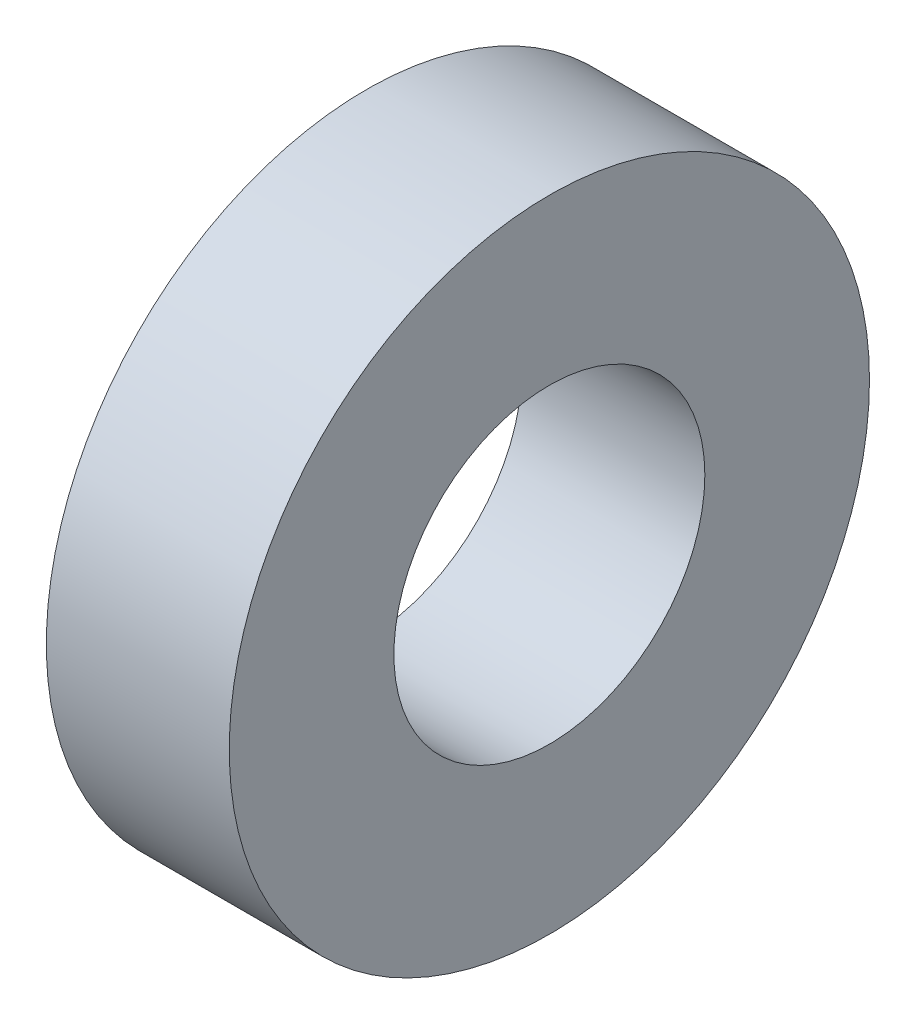
ISO-10303-21;
HEADER;
FILE_DESCRIPTION(('STEP AP214'),'2;1');
FILE_NAME('part.step','',(''),(''),'','','');
FILE_SCHEMA(('AUTOMOTIVE_DESIGN { 1 0 10303 214 1 1 1 1 }'));
ENDSEC;
DATA;
#1=APPLICATION_CONTEXT('core data for automotive mechanical design processes');
#2=APPLICATION_PROTOCOL_DEFINITION('international standard','automotive_design',2000,#1);
#3=PRODUCT_CONTEXT('',#1,'mechanical');
#4=PRODUCT('Part','Part','',(#3));
#5=PRODUCT_RELATED_PRODUCT_CATEGORY('part','',(#4));
#6=PRODUCT_DEFINITION_FORMATION('','',#4);
#7=PRODUCT_DEFINITION_CONTEXT('part definition',#1,'design');
#8=PRODUCT_DEFINITION('design','',#6,#7);
#9=PRODUCT_DEFINITION_SHAPE('','',#8);
#10=(LENGTH_UNIT() NAMED_UNIT(*) SI_UNIT(.MILLI.,.METRE.));
#11=(NAMED_UNIT(*) PLANE_ANGLE_UNIT() SI_UNIT($,.RADIAN.));
#12=(NAMED_UNIT(*) SI_UNIT($,.STERADIAN.) SOLID_ANGLE_UNIT());
#13=UNCERTAINTY_MEASURE_WITH_UNIT(LENGTH_MEASURE(1.E-05),#10,'distance_accuracy_value','');
#14=(GEOMETRIC_REPRESENTATION_CONTEXT(3) GLOBAL_UNCERTAINTY_ASSIGNED_CONTEXT((#13)) GLOBAL_UNIT_ASSIGNED_CONTEXT((#10,
#11,#12)) REPRESENTATION_CONTEXT('',''));
#15=CARTESIAN_POINT('',(0.,0.,0.));
#16=DIRECTION('',(0.,0.,1.));
#17=DIRECTION('',(1.,0.,0.));
#18=AXIS2_PLACEMENT_3D('',#15,#16,#17);
#19=CARTESIAN_POINT('',(10.,0.,0.));
#20=DIRECTION('',(1.,0.,0.));
#21=DIRECTION('',(0.,0.,-1.));
#22=AXIS2_PLACEMENT_3D('',#19,#20,#21);
#23=PLANE('',#22);
#24=CARTESIAN_POINT('',(10.,0.,0.));
#25=DIRECTION('',(1.,0.,0.));
#26=DIRECTION('',(0.,0.,-1.));
#27=AXIS2_PLACEMENT_3D('',#24,#25,#26);
#28=CIRCLE('',#27,17.5);
#29=CARTESIAN_POINT('',(10.,0.,-17.5));
#30=VERTEX_POINT('',#29);
#31=EDGE_CURVE('E10',#30,#30,#28,.T.);
#32=ORIENTED_EDGE('',*,*,#31,.T.);
#33=EDGE_LOOP('',(#32));
#34=FACE_BOUND('',#33,.T.);
#35=CARTESIAN_POINT('',(10.,0.,0.));
#36=DIRECTION('',(1.,0.,0.));
#37=DIRECTION('',(0.,0.,-1.));
#38=AXIS2_PLACEMENT_3D('',#35,#36,#37);
#39=CIRCLE('',#38,8.5);
#40=CARTESIAN_POINT('',(10.,0.,-8.5));
#41=VERTEX_POINT('',#40);
#42=EDGE_CURVE('E44',#41,#41,#39,.T.);
#43=ORIENTED_EDGE('',*,*,#42,.F.);
#44=EDGE_LOOP('',(#43));
#45=FACE_BOUND('',#44,.T.);
#46=ADVANCED_FACE('F33',(#34,#45),#23,.T.);
#47=CARTESIAN_POINT('',(0.,0.,0.));
#48=DIRECTION('',(1.,0.,0.));
#49=DIRECTION('',(0.,0.,-1.));
#50=AXIS2_PLACEMENT_3D('',#47,#48,#49);
#51=PLANE('',#50);
#52=CARTESIAN_POINT('',(0.,0.,0.));
#53=DIRECTION('',(1.,0.,0.));
#54=DIRECTION('',(0.,0.,-1.));
#55=AXIS2_PLACEMENT_3D('',#52,#53,#54);
#56=CIRCLE('',#55,17.5);
#57=CARTESIAN_POINT('',(0.,0.,-17.5));
#58=VERTEX_POINT('',#57);
#59=EDGE_CURVE('E37',#58,#58,#56,.T.);
#60=ORIENTED_EDGE('',*,*,#59,.F.);
#61=EDGE_LOOP('',(#60));
#62=FACE_BOUND('',#61,.T.);
#63=CARTESIAN_POINT('',(0.,0.,0.));
#64=DIRECTION('',(1.,0.,0.));
#65=DIRECTION('',(0.,0.,-1.));
#66=AXIS2_PLACEMENT_3D('',#63,#64,#65);
#67=CIRCLE('',#66,8.5);
#68=CARTESIAN_POINT('',(0.,0.,-8.5));
#69=VERTEX_POINT('',#68);
#70=EDGE_CURVE('E46',#69,#69,#67,.T.);
#71=ORIENTED_EDGE('',*,*,#70,.T.);
#72=EDGE_LOOP('',(#71));
#73=FACE_BOUND('',#72,.T.);
#74=ADVANCED_FACE('F56',(#62,#73),#51,.F.);
#75=CARTESIAN_POINT('',(10.,0.,0.));
#76=DIRECTION('',(-1.,0.,0.));
#77=DIRECTION('',(0.,0.,1.));
#78=AXIS2_PLACEMENT_3D('',#75,#76,#77);
#79=CYLINDRICAL_SURFACE('',#78,17.5);
#80=ORIENTED_EDGE('',*,*,#31,.F.);
#81=EDGE_LOOP('',(#80));
#82=FACE_BOUND('',#81,.T.);
#83=ORIENTED_EDGE('',*,*,#59,.T.);
#84=EDGE_LOOP('',(#83));
#85=FACE_BOUND('',#84,.T.);
#86=ADVANCED_FACE('F35',(#82,#85),#79,.T.);
#87=CARTESIAN_POINT('',(10.,0.,0.));
#88=DIRECTION('',(-1.,0.,0.));
#89=DIRECTION('',(0.,0.,1.));
#90=AXIS2_PLACEMENT_3D('',#87,#88,#89);
#91=CYLINDRICAL_SURFACE('',#90,8.5);
#92=ORIENTED_EDGE('',*,*,#42,.T.);
#93=EDGE_LOOP('',(#92));
#94=FACE_BOUND('',#93,.T.);
#95=ORIENTED_EDGE('',*,*,#70,.F.);
#96=EDGE_LOOP('',(#95));
#97=FACE_BOUND('',#96,.T.);
#98=ADVANCED_FACE('F52',(#94,#97),#91,.F.);
#99=CLOSED_SHELL('',(#46,#74,#86,#98));
#100=MANIFOLD_SOLID_BREP('B2',#99);
#101=ADVANCED_BREP_SHAPE_REPRESENTATION('',(#18,#100),#14);
#102=SHAPE_DEFINITION_REPRESENTATION(#9,#101);
ENDSEC;
END-ISO-10303-21;
